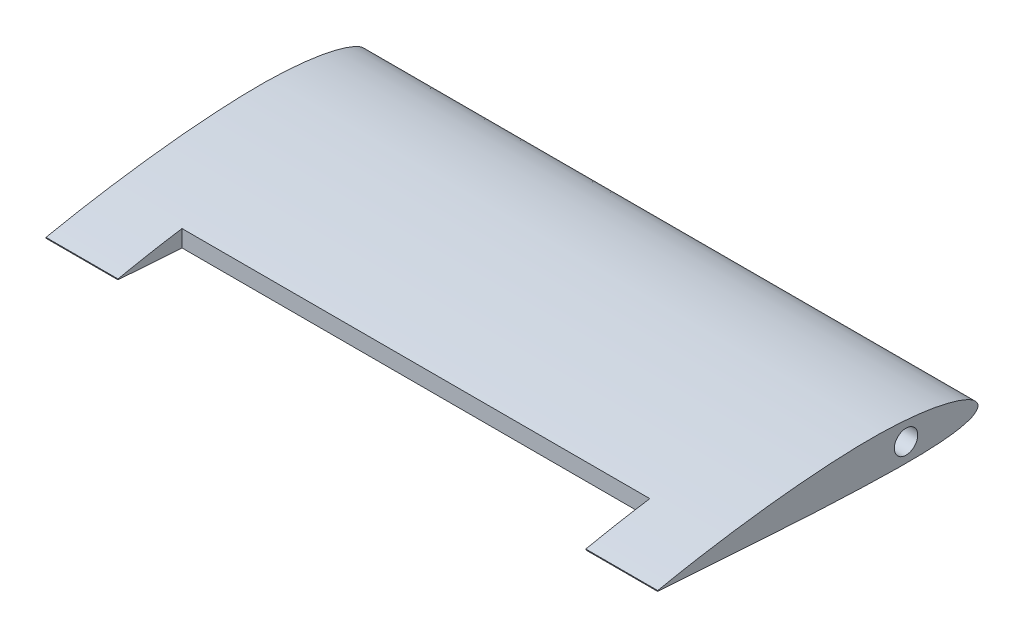
ISO-10303-21;
HEADER;
FILE_DESCRIPTION(('STEP AP214'),'2;1');
FILE_NAME('part.step','',(''),(''),'','','');
FILE_SCHEMA(('AUTOMOTIVE_DESIGN { 1 0 10303 214 1 1 1 1 }'));
ENDSEC;
DATA;
#1=APPLICATION_CONTEXT('core data for automotive mechanical design processes');
#2=APPLICATION_PROTOCOL_DEFINITION('international standard','automotive_design',2000,#1);
#3=PRODUCT_CONTEXT('',#1,'mechanical');
#4=PRODUCT('Part','Part','',(#3));
#5=PRODUCT_RELATED_PRODUCT_CATEGORY('part','',(#4));
#6=PRODUCT_DEFINITION_FORMATION('','',#4);
#7=PRODUCT_DEFINITION_CONTEXT('part definition',#1,'design');
#8=PRODUCT_DEFINITION('design','',#6,#7);
#9=PRODUCT_DEFINITION_SHAPE('','',#8);
#10=(LENGTH_UNIT() NAMED_UNIT(*) SI_UNIT(.MILLI.,.METRE.));
#11=(NAMED_UNIT(*) PLANE_ANGLE_UNIT() SI_UNIT($,.RADIAN.));
#12=(NAMED_UNIT(*) SI_UNIT($,.STERADIAN.) SOLID_ANGLE_UNIT());
#13=UNCERTAINTY_MEASURE_WITH_UNIT(LENGTH_MEASURE(1.E-05),#10,'distance_accuracy_value','');
#14=(GEOMETRIC_REPRESENTATION_CONTEXT(3) GLOBAL_UNCERTAINTY_ASSIGNED_CONTEXT((#13)) GLOBAL_UNIT_ASSIGNED_CONTEXT((#10,
#11,#12)) REPRESENTATION_CONTEXT('',''));
#15=CARTESIAN_POINT('',(0.,0.,0.));
#16=DIRECTION('',(0.,0.,1.));
#17=DIRECTION('',(1.,0.,0.));
#18=AXIS2_PLACEMENT_3D('',#15,#16,#17);
#19=CARTESIAN_POINT('',(0.,0.,89.));
#20=DIRECTION('',(0.,0.,1.));
#21=DIRECTION('',(1.,0.,0.));
#22=AXIS2_PLACEMENT_3D('',#19,#20,#21);
#23=PLANE('',#22);
#24=DIRECTION('',(0.,1.,0.));
#25=VECTOR('',#24,1.);
#26=CARTESIAN_POINT('',(-100.,0.,89.));
#27=LINE('',#26,#25);
#28=CARTESIAN_POINT('',(-100.,21.1572890238036,89.));
#29=VERTEX_POINT('',#28);
#30=CARTESIAN_POINT('',(-100.,21.3886732850242,89.));
#31=VERTEX_POINT('',#30);
#32=EDGE_CURVE('E151',#29,#31,#27,.T.);
#33=ORIENTED_EDGE('',*,*,#32,.F.);
#34=DIRECTION('',(1.,0.,0.));
#35=VECTOR('',#34,1.);
#36=CARTESIAN_POINT('',(-250.,21.1572890238036,89.));
#37=LINE('',#36,#35);
#38=CARTESIAN_POINT('',(-80.,21.1572890238036,89.));
#39=VERTEX_POINT('',#38);
#40=EDGE_CURVE('E156',#29,#39,#37,.T.);
#41=ORIENTED_EDGE('',*,*,#40,.T.);
#42=DIRECTION('',(0.,-1.,0.));
#43=VECTOR('',#42,1.);
#44=CARTESIAN_POINT('',(-80.,0.,89.));
#45=LINE('',#44,#43);
#46=CARTESIAN_POINT('',(-80.,21.3886732850242,89.));
#47=VERTEX_POINT('',#46);
#48=EDGE_CURVE('E200',#47,#39,#45,.T.);
#49=ORIENTED_EDGE('',*,*,#48,.F.);
#50=DIRECTION('',(1.,0.,0.));
#51=VECTOR('',#50,1.);
#52=CARTESIAN_POINT('',(-250.,21.3886732850242,89.));
#53=LINE('',#52,#51);
#54=EDGE_CURVE('E161',#31,#47,#53,.T.);
#55=ORIENTED_EDGE('',*,*,#54,.F.);
#56=EDGE_LOOP('',(#33,#41,#49,#55));
#57=FACE_BOUND('',#56,.T.);
#58=ADVANCED_FACE('F54',(#57),#23,.T.);
#59=CARTESIAN_POINT('',(-250.,21.3886732850242,89.));
#60=CARTESIAN_POINT('',(-250.,21.6924393138106,87.5175902156763));
#61=CARTESIAN_POINT('',(-250.,22.2991735538198,84.5566640796384));
#62=CARTESIAN_POINT('',(-250.,23.4104909631112,78.6297269469736));
#63=CARTESIAN_POINT('',(-250.,24.641831569462,71.2170631809324));
#64=CARTESIAN_POINT('',(-250.,25.9162390672229,62.3159799477099));
#65=CARTESIAN_POINT('',(-250.,26.9790478293723,53.4163650243348));
#66=CARTESIAN_POINT('',(-250.,27.757252312656,44.5128917718668));
#67=CARTESIAN_POINT('',(-250.,28.2842497525229,35.6114461447732));
#68=CARTESIAN_POINT('',(-250.,28.3734546736372,28.1847004811248));
#69=CARTESIAN_POINT('',(-250.,28.1277297242642,22.2491575224991));
#70=CARTESIAN_POINT('',(-250.,27.7676716658709,17.7938603249267));
#71=CARTESIAN_POINT('',(-250.,27.1974963055456,13.3329383648118));
#72=CARTESIAN_POINT('',(-250.,26.4953694537602,9.62034210956704));
#73=CARTESIAN_POINT('',(-250.,25.701015566182,6.66058751576171));
#74=CARTESIAN_POINT('',(-250.,24.9788303768218,4.4166755350325));
#75=CARTESIAN_POINT('',(-250.,24.1373761617376,2.51552543990555));
#76=CARTESIAN_POINT('',(-250.,23.1172060054036,0.875610555548998));
#77=CARTESIAN_POINT('',(-250.,21.3529663487488,-0.554450875401541));
#78=CARTESIAN_POINT('',(-250.,19.8022315361252,0.931001928104729));
#79=CARTESIAN_POINT('',(-250.,19.0949550918379,2.54024256096899));
#80=CARTESIAN_POINT('',(-250.,18.5577036137218,4.43302859202716));
#81=CARTESIAN_POINT('',(-250.,18.1724928525861,6.66955299200507));
#82=CARTESIAN_POINT('',(-250.,17.8437583770492,9.64115310370391));
#83=CARTESIAN_POINT('',(-250.,17.590735707999,13.3504314681179));
#84=CARTESIAN_POINT('',(-250.,17.4892914666729,17.8043187113869));
#85=CARTESIAN_POINT('',(-250.,17.5034280625483,22.2550272141336));
#86=CARTESIAN_POINT('',(-250.,17.6344002740936,28.1885067397123));
#87=CARTESIAN_POINT('',(-250.,17.8700772068071,35.6060485187279));
#88=CARTESIAN_POINT('',(-250.,18.280226492312,44.5059981210921));
#89=CARTESIAN_POINT('',(-250.,18.8133186654621,53.4033670106579));
#90=CARTESIAN_POINT('',(-250.,19.3674253006102,62.3022449763705));
#91=CARTESIAN_POINT('',(-250.,19.9283008784247,71.2026444966919));
#92=CARTESIAN_POINT('',(-250.,20.4448648269986,78.6172037371231));
#93=CARTESIAN_POINT('',(-250.,20.8433000555565,84.5506800402072));
#94=CARTESIAN_POINT('',(-250.,21.052621242818,87.5168254487195));
#95=CARTESIAN_POINT('',(-250.,21.1572890238036,89.));
#96=B_SPLINE_CURVE_WITH_KNOTS('',3,(#59,#60,#61,#62,#63,#64,#65,#66,#67,#68,#69,#70,#71,#72,#73,
#74,#75,#76,#77,#78,#79,#80,#81,#82,#83,#84,#85,#86,#87,#88,#89,#90,#91,#92,#93,#94,#95),
.UNSPECIFIED.,.F.,.F.,(4,1,1,1,1,1,1,1,1,1,1,1,1,1,1,1,1,1,1,1,1,1,1,1,1,1,1,1,1,1,1,1,1,1,4),
(0.,0.0250124897498648,0.0499592861642578,0.0996729249269686,0.149206319909966,
0.198581096615965,0.247805170456833,0.296916574601493,0.345952721793533,0.370491625569911,
0.395091203654929,0.41981479582396,0.444798575016595,0.457489818915221,0.47040640543549,
0.483879408669829,0.491264120322896,0.503458853294665,0.513609129403887,0.520450990700287,
0.533235387615153,0.545691039147803,0.558031884237173,0.582609167247894,0.607134741746914,
0.631652079836766,0.656174271859652,0.705233949250519,0.754320378530032,0.803437363555032,
0.852566095729537,0.901700994033255,0.950848809337271,0.975422716989279,1.),.UNSPECIFIED.);
#97=DIRECTION('',(1.,0.,0.));
#98=VECTOR('',#97,1.);
#99=SURFACE_OF_LINEAR_EXTRUSION('',#96,#98);
#100=DIRECTION('',(1.,0.,0.));
#101=VECTOR('',#100,1.);
#102=CARTESIAN_POINT('',(-250.,24.6104413253253,71.2));
#103=LINE('',#102,#101);
#104=CARTESIAN_POINT('',(-230.,24.6104413268867,71.2));
#105=VERTEX_POINT('',#104);
#106=CARTESIAN_POINT('',(-100.,24.6104413268867,71.2));
#107=VERTEX_POINT('',#106);
#108=EDGE_CURVE('E12',#105,#107,#103,.T.);
#109=ORIENTED_EDGE('',*,*,#108,.T.);
#110=CARTESIAN_POINT('',(-100.,21.3886732850242,89.));
#111=CARTESIAN_POINT('',(-100.,21.6924393138106,87.5175902156763));
#112=CARTESIAN_POINT('',(-100.,22.2991735538198,84.5566640796384));
#113=CARTESIAN_POINT('',(-100.,23.4104909631112,78.6297269469736));
#114=CARTESIAN_POINT('',(-100.,24.641831569462,71.2170631809324));
#115=CARTESIAN_POINT('',(-100.,25.9162390672229,62.3159799477099));
#116=CARTESIAN_POINT('',(-100.,26.9790478293723,53.4163650243348));
#117=CARTESIAN_POINT('',(-100.,27.757252312656,44.5128917718668));
#118=CARTESIAN_POINT('',(-100.,28.2842497525229,35.6114461447732));
#119=CARTESIAN_POINT('',(-100.,28.3734546736372,28.1847004811248));
#120=CARTESIAN_POINT('',(-100.,28.1277297242642,22.2491575224991));
#121=CARTESIAN_POINT('',(-100.,27.7676716658709,17.7938603249267));
#122=CARTESIAN_POINT('',(-100.,27.1974963055456,13.3329383648118));
#123=CARTESIAN_POINT('',(-100.,26.4953694537602,9.62034210956704));
#124=CARTESIAN_POINT('',(-100.,25.701015566182,6.66058751576171));
#125=CARTESIAN_POINT('',(-100.,24.9788303768218,4.4166755350325));
#126=CARTESIAN_POINT('',(-100.,24.1373761617376,2.51552543990555));
#127=CARTESIAN_POINT('',(-100.,23.1172060054036,0.875610555548998));
#128=CARTESIAN_POINT('',(-100.,21.3529663487488,-0.554450875401541));
#129=CARTESIAN_POINT('',(-100.,19.8022315361252,0.931001928104729));
#130=CARTESIAN_POINT('',(-100.,19.0949550918379,2.54024256096899));
#131=CARTESIAN_POINT('',(-100.,18.5577036137218,4.43302859202716));
#132=CARTESIAN_POINT('',(-100.,18.1724928525861,6.66955299200507));
#133=CARTESIAN_POINT('',(-100.,17.8437583770492,9.64115310370391));
#134=CARTESIAN_POINT('',(-100.,17.590735707999,13.3504314681179));
#135=CARTESIAN_POINT('',(-100.,17.4892914666729,17.8043187113869));
#136=CARTESIAN_POINT('',(-100.,17.5034280625483,22.2550272141336));
#137=CARTESIAN_POINT('',(-100.,17.6344002740936,28.1885067397123));
#138=CARTESIAN_POINT('',(-100.,17.8700772068071,35.6060485187279));
#139=CARTESIAN_POINT('',(-100.,18.280226492312,44.5059981210921));
#140=CARTESIAN_POINT('',(-100.,18.8133186654621,53.4033670106579));
#141=CARTESIAN_POINT('',(-100.,19.3674253006102,62.3022449763705));
#142=CARTESIAN_POINT('',(-100.,19.9283008784247,71.2026444966919));
#143=CARTESIAN_POINT('',(-100.,20.4448648269986,78.6172037371231));
#144=CARTESIAN_POINT('',(-100.,20.8433000555565,84.5506800402072));
#145=CARTESIAN_POINT('',(-100.,21.052621242818,87.5168254487195));
#146=CARTESIAN_POINT('',(-100.,21.1572890238036,89.));
#147=B_SPLINE_CURVE_WITH_KNOTS('',3,(#110,#111,#112,#113,#114,#115,#116,#117,#118,#119,#120,
#121,#122,#123,#124,#125,#126,#127,#128,#129,#130,#131,#132,#133,#134,#135,#136,#137,#138,#139,
#140,#141,#142,#143,#144,#145,#146),.UNSPECIFIED.,.F.,.F.,(4,1,1,1,1,1,1,1,1,1,1,1,1,1,1,1,1,1,
1,1,1,1,1,1,1,1,1,1,1,1,1,1,1,1,4),(0.,0.0250124897498648,0.0499592861642578,0.0996729249269686,
0.149206319909966,0.198581096615965,0.247805170456833,0.296916574601493,0.345952721793533,
0.370491625569911,0.395091203654929,0.41981479582396,0.444798575016595,0.457489818915221,
0.47040640543549,0.483879408669829,0.491264120322896,0.503458853294665,0.513609129403887,
0.520450990700287,0.533235387615153,0.545691039147803,0.558031884237173,0.582609167247894,
0.607134741746914,0.631652079836766,0.656174271859652,0.705233949250519,0.754320378530032,
0.803437363555032,0.852566095729537,0.901700994033255,0.950848809337271,0.975422716989279,1.),.UNSPECIFIED.);
#148=EDGE_CURVE('E216',#107,#31,#147,.F.);
#149=ORIENTED_EDGE('',*,*,#148,.T.);
#150=ORIENTED_EDGE('',*,*,#54,.T.);
#151=CARTESIAN_POINT('',(-80.,21.1572890238036,89.));
#152=CARTESIAN_POINT('',(-80.,21.052621242818,87.5168254487195));
#153=CARTESIAN_POINT('',(-80.,20.8433000555565,84.5506800402072));
#154=CARTESIAN_POINT('',(-80.,20.4448648269986,78.6172037371231));
#155=CARTESIAN_POINT('',(-80.,19.9283008784247,71.2026444966919));
#156=CARTESIAN_POINT('',(-80.,19.3674253006102,62.3022449763705));
#157=CARTESIAN_POINT('',(-80.,18.8133186654621,53.4033670106579));
#158=CARTESIAN_POINT('',(-80.,18.280226492312,44.5059981210921));
#159=CARTESIAN_POINT('',(-80.,17.8700772068071,35.6060485187279));
#160=CARTESIAN_POINT('',(-80.,17.6344002740936,28.1885067397123));
#161=CARTESIAN_POINT('',(-80.,17.5034280625483,22.2550272141336));
#162=CARTESIAN_POINT('',(-80.,17.4892914666729,17.8043187113869));
#163=CARTESIAN_POINT('',(-80.,17.590735707999,13.3504314681179));
#164=CARTESIAN_POINT('',(-80.,17.8437583770492,9.64115310370391));
#165=CARTESIAN_POINT('',(-80.,18.1724928525861,6.66955299200507));
#166=CARTESIAN_POINT('',(-80.,18.5577036137218,4.43302859202716));
#167=CARTESIAN_POINT('',(-80.,19.0949550918379,2.54024256096899));
#168=CARTESIAN_POINT('',(-80.,19.8022315361252,0.931001928104729));
#169=CARTESIAN_POINT('',(-80.,21.3529663487488,-0.554450875401541));
#170=CARTESIAN_POINT('',(-80.,23.1172060054036,0.875610555548998));
#171=CARTESIAN_POINT('',(-80.,24.1373761617376,2.51552543990555));
#172=CARTESIAN_POINT('',(-80.,24.9788303768218,4.4166755350325));
#173=CARTESIAN_POINT('',(-80.,25.701015566182,6.66058751576171));
#174=CARTESIAN_POINT('',(-80.,26.4953694537602,9.62034210956704));
#175=CARTESIAN_POINT('',(-80.,27.1974963055456,13.3329383648118));
#176=CARTESIAN_POINT('',(-80.,27.7676716658709,17.7938603249267));
#177=CARTESIAN_POINT('',(-80.,28.1277297242642,22.2491575224991));
#178=CARTESIAN_POINT('',(-80.,28.3734546736372,28.1847004811248));
#179=CARTESIAN_POINT('',(-80.,28.2842497525229,35.6114461447732));
#180=CARTESIAN_POINT('',(-80.,27.757252312656,44.5128917718668));
#181=CARTESIAN_POINT('',(-80.,26.9790478293723,53.4163650243348));
#182=CARTESIAN_POINT('',(-80.,25.9162390672229,62.3159799477099));
#183=CARTESIAN_POINT('',(-80.,24.641831569462,71.2170631809324));
#184=CARTESIAN_POINT('',(-80.,23.4104909631112,78.6297269469736));
#185=CARTESIAN_POINT('',(-80.,22.2991735538198,84.5566640796384));
#186=CARTESIAN_POINT('',(-80.,21.6924393138106,87.5175902156763));
#187=CARTESIAN_POINT('',(-80.,21.3886732850242,89.));
#188=B_SPLINE_CURVE_WITH_KNOTS('',3,(#151,#152,#153,#154,#155,#156,#157,#158,#159,#160,#161,
#162,#163,#164,#165,#166,#167,#168,#169,#170,#171,#172,#173,#174,#175,#176,#177,#178,#179,#180,
#181,#182,#183,#184,#185,#186,#187),.UNSPECIFIED.,.F.,.F.,(4,1,1,1,1,1,1,1,1,1,1,1,1,1,1,1,1,1,
1,1,1,1,1,1,1,1,1,1,1,1,1,1,1,1,4),(0.,0.0245772830107215,0.0491511906627294,0.0982990059667455,
0.147433904270463,0.196562636444968,0.245679621469968,0.294766050749481,0.343825728140348,
0.368347920163234,0.392865258253086,0.417390832752106,0.441968115762827,0.454308960852197,
0.466764612384847,0.479549009299713,0.486390870596113,0.496541146705335,0.508735879677104,
0.516120591330171,0.52959359456451,0.542510181084779,0.555201424983405,0.58018520417604,
0.604908796345071,0.629508374430089,0.654047278206467,0.703083425398507,0.752194829543167,
0.801418903384035,0.850793680090034,0.900327075073031,0.950040713835742,0.974987510250135,1.),.UNSPECIFIED.);
#189=EDGE_CURVE('E176',#39,#47,#188,.T.);
#190=ORIENTED_EDGE('',*,*,#189,.F.);
#191=ORIENTED_EDGE('',*,*,#40,.F.);
#192=CARTESIAN_POINT('',(-100.,19.9379916386358,71.2));
#193=VERTEX_POINT('',#192);
#194=EDGE_CURVE('E150',#29,#193,#147,.F.);
#195=ORIENTED_EDGE('',*,*,#194,.T.);
#196=DIRECTION('',(1.,0.,0.));
#197=VECTOR('',#196,1.);
#198=CARTESIAN_POINT('',(-250.,19.9379916373415,71.2));
#199=LINE('',#198,#197);
#200=CARTESIAN_POINT('',(-230.,19.9379916386358,71.2));
#201=VERTEX_POINT('',#200);
#202=EDGE_CURVE('E62',#193,#201,#199,.F.);
#203=ORIENTED_EDGE('',*,*,#202,.T.);
#204=CARTESIAN_POINT('',(-230.,21.3886732850242,89.));
#205=CARTESIAN_POINT('',(-230.,21.6924393138106,87.5175902156763));
#206=CARTESIAN_POINT('',(-230.,22.2991735538198,84.5566640796384));
#207=CARTESIAN_POINT('',(-230.,23.4104909631112,78.6297269469736));
#208=CARTESIAN_POINT('',(-230.,24.641831569462,71.2170631809324));
#209=CARTESIAN_POINT('',(-230.,25.9162390672229,62.3159799477099));
#210=CARTESIAN_POINT('',(-230.,26.9790478293723,53.4163650243348));
#211=CARTESIAN_POINT('',(-230.,27.757252312656,44.5128917718668));
#212=CARTESIAN_POINT('',(-230.,28.2842497525229,35.6114461447732));
#213=CARTESIAN_POINT('',(-230.,28.3734546736372,28.1847004811248));
#214=CARTESIAN_POINT('',(-230.,28.1277297242642,22.2491575224991));
#215=CARTESIAN_POINT('',(-230.,27.7676716658709,17.7938603249267));
#216=CARTESIAN_POINT('',(-230.,27.1974963055456,13.3329383648118));
#217=CARTESIAN_POINT('',(-230.,26.4953694537602,9.62034210956704));
#218=CARTESIAN_POINT('',(-230.,25.701015566182,6.66058751576171));
#219=CARTESIAN_POINT('',(-230.,24.9788303768218,4.4166755350325));
#220=CARTESIAN_POINT('',(-230.,24.1373761617376,2.51552543990555));
#221=CARTESIAN_POINT('',(-230.,23.1172060054036,0.875610555548998));
#222=CARTESIAN_POINT('',(-230.,21.3529663487488,-0.554450875401541));
#223=CARTESIAN_POINT('',(-230.,19.8022315361252,0.931001928104729));
#224=CARTESIAN_POINT('',(-230.,19.0949550918379,2.54024256096899));
#225=CARTESIAN_POINT('',(-230.,18.5577036137218,4.43302859202716));
#226=CARTESIAN_POINT('',(-230.,18.1724928525861,6.66955299200507));
#227=CARTESIAN_POINT('',(-230.,17.8437583770492,9.64115310370391));
#228=CARTESIAN_POINT('',(-230.,17.590735707999,13.3504314681179));
#229=CARTESIAN_POINT('',(-230.,17.4892914666729,17.8043187113869));
#230=CARTESIAN_POINT('',(-230.,17.5034280625483,22.2550272141336));
#231=CARTESIAN_POINT('',(-230.,17.6344002740936,28.1885067397123));
#232=CARTESIAN_POINT('',(-230.,17.8700772068071,35.6060485187279));
#233=CARTESIAN_POINT('',(-230.,18.280226492312,44.5059981210921));
#234=CARTESIAN_POINT('',(-230.,18.8133186654621,53.4033670106579));
#235=CARTESIAN_POINT('',(-230.,19.3674253006102,62.3022449763705));
#236=CARTESIAN_POINT('',(-230.,19.9283008784247,71.2026444966919));
#237=CARTESIAN_POINT('',(-230.,20.4448648269986,78.6172037371231));
#238=CARTESIAN_POINT('',(-230.,20.8433000555565,84.5506800402072));
#239=CARTESIAN_POINT('',(-230.,21.052621242818,87.5168254487195));
#240=CARTESIAN_POINT('',(-230.,21.1572890238036,89.));
#241=B_SPLINE_CURVE_WITH_KNOTS('',3,(#204,#205,#206,#207,#208,#209,#210,#211,#212,#213,#214,
#215,#216,#217,#218,#219,#220,#221,#222,#223,#224,#225,#226,#227,#228,#229,#230,#231,#232,#233,
#234,#235,#236,#237,#238,#239,#240),.UNSPECIFIED.,.F.,.F.,(4,1,1,1,1,1,1,1,1,1,1,1,1,1,1,1,1,1,
1,1,1,1,1,1,1,1,1,1,1,1,1,1,1,1,4),(0.,0.0250124897498648,0.0499592861642578,0.0996729249269686,
0.149206319909966,0.198581096615965,0.247805170456833,0.296916574601493,0.345952721793533,
0.370491625569911,0.395091203654929,0.41981479582396,0.444798575016595,0.457489818915221,
0.47040640543549,0.483879408669829,0.491264120322896,0.503458853294665,0.513609129403887,
0.520450990700287,0.533235387615153,0.545691039147803,0.558031884237173,0.582609167247894,
0.607134741746914,0.631652079836766,0.656174271859652,0.705233949250519,0.754320378530032,
0.803437363555032,0.852566095729537,0.901700994033255,0.950848809337271,0.975422716989279,1.),.UNSPECIFIED.);
#242=CARTESIAN_POINT('',(-230.,21.1572890238036,89.));
#243=VERTEX_POINT('',#242);
#244=EDGE_CURVE('E130',#201,#243,#241,.T.);
#245=ORIENTED_EDGE('',*,*,#244,.T.);
#246=CARTESIAN_POINT('',(-250.,21.1572890238036,89.));
#247=VERTEX_POINT('',#246);
#248=EDGE_CURVE('E159',#247,#243,#37,.T.);
#249=ORIENTED_EDGE('',*,*,#248,.F.);
#250=CARTESIAN_POINT('',(-250.,21.3886732850242,89.));
#251=VERTEX_POINT('',#250);
#252=EDGE_CURVE('E192',#251,#247,#96,.T.);
#253=ORIENTED_EDGE('',*,*,#252,.F.);
#254=CARTESIAN_POINT('',(-230.,21.3886732850242,89.));
#255=VERTEX_POINT('',#254);
#256=EDGE_CURVE('E160',#251,#255,#53,.T.);
#257=ORIENTED_EDGE('',*,*,#256,.T.);
#258=EDGE_CURVE('E69',#255,#105,#241,.T.);
#259=ORIENTED_EDGE('',*,*,#258,.T.);
#260=EDGE_LOOP('',(#109,#149,#150,#190,#191,#195,#203,#245,#249,#253,#257,#259));
#261=FACE_BOUND('',#260,.T.);
#262=DIRECTION('',(1.,0.,0.));
#263=VECTOR('',#262,1.);
#264=CARTESIAN_POINT('',(-250.,19.3809270136828,62.4999990139523));
#265=LINE('',#264,#263);
#266=CARTESIAN_POINT('',(-146.5,19.3809270136828,62.4999990139523));
#267=VERTEX_POINT('',#266);
#268=CARTESIAN_POINT('',(-183.5,19.3809270136828,62.499999013952));
#269=VERTEX_POINT('',#268);
#270=EDGE_CURVE('E155',#267,#269,#265,.F.);
#271=ORIENTED_EDGE('',*,*,#270,.F.);
#272=CARTESIAN_POINT('',(-146.5,21.3886732850242,89.));
#273=CARTESIAN_POINT('',(-146.5,21.6924393138106,87.5175902156763));
#274=CARTESIAN_POINT('',(-146.5,22.2991735538198,84.5566640796384));
#275=CARTESIAN_POINT('',(-146.5,23.4104909631112,78.6297269469736));
#276=CARTESIAN_POINT('',(-146.5,24.641831569462,71.2170631809324));
#277=CARTESIAN_POINT('',(-146.5,25.9162390672229,62.3159799477099));
#278=CARTESIAN_POINT('',(-146.5,26.9790478293723,53.4163650243348));
#279=CARTESIAN_POINT('',(-146.5,27.757252312656,44.5128917718668));
#280=CARTESIAN_POINT('',(-146.5,28.2842497525229,35.6114461447732));
#281=CARTESIAN_POINT('',(-146.5,28.3734546736372,28.1847004811248));
#282=CARTESIAN_POINT('',(-146.5,28.1277297242642,22.2491575224991));
#283=CARTESIAN_POINT('',(-146.5,27.7676716658709,17.7938603249267));
#284=CARTESIAN_POINT('',(-146.5,27.1974963055456,13.3329383648118));
#285=CARTESIAN_POINT('',(-146.5,26.4953694537602,9.62034210956704));
#286=CARTESIAN_POINT('',(-146.5,25.701015566182,6.66058751576171));
#287=CARTESIAN_POINT('',(-146.5,24.9788303768218,4.4166755350325));
#288=CARTESIAN_POINT('',(-146.5,24.1373761617376,2.51552543990555));
#289=CARTESIAN_POINT('',(-146.5,23.1172060054036,0.875610555548998));
#290=CARTESIAN_POINT('',(-146.5,21.3529663487488,-0.554450875401541));
#291=CARTESIAN_POINT('',(-146.5,19.8022315361252,0.931001928104729));
#292=CARTESIAN_POINT('',(-146.5,19.0949550918379,2.54024256096899));
#293=CARTESIAN_POINT('',(-146.5,18.5577036137218,4.43302859202716));
#294=CARTESIAN_POINT('',(-146.5,18.1724928525861,6.66955299200507));
#295=CARTESIAN_POINT('',(-146.5,17.8437583770492,9.64115310370391));
#296=CARTESIAN_POINT('',(-146.5,17.590735707999,13.3504314681179));
#297=CARTESIAN_POINT('',(-146.5,17.4892914666729,17.8043187113869));
#298=CARTESIAN_POINT('',(-146.5,17.5034280625483,22.2550272141336));
#299=CARTESIAN_POINT('',(-146.5,17.6344002740936,28.1885067397123));
#300=CARTESIAN_POINT('',(-146.5,17.8700772068071,35.6060485187279));
#301=CARTESIAN_POINT('',(-146.5,18.280226492312,44.5059981210921));
#302=CARTESIAN_POINT('',(-146.5,18.8133186654621,53.4033670106579));
#303=CARTESIAN_POINT('',(-146.5,19.3674253006102,62.3022449763705));
#304=CARTESIAN_POINT('',(-146.5,19.9283008784247,71.2026444966919));
#305=CARTESIAN_POINT('',(-146.5,20.4448648269986,78.6172037371231));
#306=CARTESIAN_POINT('',(-146.5,20.8433000555565,84.5506800402072));
#307=CARTESIAN_POINT('',(-146.5,21.052621242818,87.5168254487195));
#308=CARTESIAN_POINT('',(-146.5,21.1572890238036,89.));
#309=B_SPLINE_CURVE_WITH_KNOTS('',3,(#272,#273,#274,#275,#276,#277,#278,#279,#280,#281,#282,
#283,#284,#285,#286,#287,#288,#289,#290,#291,#292,#293,#294,#295,#296,#297,#298,#299,#300,#301,
#302,#303,#304,#305,#306,#307,#308),.UNSPECIFIED.,.F.,.F.,(4,1,1,1,1,1,1,1,1,1,1,1,1,1,1,1,1,1,
1,1,1,1,1,1,1,1,1,1,1,1,1,1,1,1,4),(0.,0.0250124897498648,0.0499592861642578,0.0996729249269686,
0.149206319909966,0.198581096615965,0.247805170456833,0.296916574601493,0.345952721793533,
0.370491625569911,0.395091203654929,0.41981479582396,0.444798575016595,0.457489818915221,
0.47040640543549,0.483879408669829,0.491264120322896,0.503458853294665,0.513609129403887,
0.520450990700287,0.533235387615153,0.545691039147803,0.558031884237173,0.582609167247894,
0.607134741746914,0.631652079836766,0.656174271859652,0.705233949250519,0.754320378530032,
0.803437363555032,0.852566095729537,0.901700994033255,0.950848809337271,0.975422716989279,1.),.UNSPECIFIED.);
#310=CARTESIAN_POINT('',(-146.5,17.6012934281473,26.4999990139523));
#311=VERTEX_POINT('',#310);
#312=EDGE_CURVE('E329',#311,#267,#309,.T.);
#313=ORIENTED_EDGE('',*,*,#312,.F.);
#314=DIRECTION('',(1.,0.,0.));
#315=VECTOR('',#314,1.);
#316=CARTESIAN_POINT('',(-250.,17.6012934281473,26.4999990139523));
#317=LINE('',#316,#315);
#318=CARTESIAN_POINT('',(-183.5,17.6012934276601,26.4999990139523));
#319=VERTEX_POINT('',#318);
#320=EDGE_CURVE('E324',#319,#311,#317,.T.);
#321=ORIENTED_EDGE('',*,*,#320,.F.);
#322=CARTESIAN_POINT('',(-183.5,21.3886732850242,89.));
#323=CARTESIAN_POINT('',(-183.5,21.6924393138106,87.5175902156763));
#324=CARTESIAN_POINT('',(-183.5,22.2991735538198,84.5566640796384));
#325=CARTESIAN_POINT('',(-183.5,23.4104909631112,78.6297269469736));
#326=CARTESIAN_POINT('',(-183.5,24.641831569462,71.2170631809324));
#327=CARTESIAN_POINT('',(-183.5,25.9162390672229,62.3159799477099));
#328=CARTESIAN_POINT('',(-183.5,26.9790478293723,53.4163650243348));
#329=CARTESIAN_POINT('',(-183.5,27.757252312656,44.5128917718668));
#330=CARTESIAN_POINT('',(-183.5,28.2842497525229,35.6114461447732));
#331=CARTESIAN_POINT('',(-183.5,28.3734546736372,28.1847004811248));
#332=CARTESIAN_POINT('',(-183.5,28.1277297242642,22.2491575224991));
#333=CARTESIAN_POINT('',(-183.5,27.7676716658709,17.7938603249267));
#334=CARTESIAN_POINT('',(-183.5,27.1974963055456,13.3329383648118));
#335=CARTESIAN_POINT('',(-183.5,26.4953694537602,9.62034210956704));
#336=CARTESIAN_POINT('',(-183.5,25.701015566182,6.66058751576171));
#337=CARTESIAN_POINT('',(-183.5,24.9788303768218,4.4166755350325));
#338=CARTESIAN_POINT('',(-183.5,24.1373761617376,2.51552543990555));
#339=CARTESIAN_POINT('',(-183.5,23.1172060054036,0.875610555548998));
#340=CARTESIAN_POINT('',(-183.5,21.3529663487488,-0.554450875401541));
#341=CARTESIAN_POINT('',(-183.5,19.8022315361252,0.931001928104729));
#342=CARTESIAN_POINT('',(-183.5,19.0949550918379,2.54024256096899));
#343=CARTESIAN_POINT('',(-183.5,18.5577036137218,4.43302859202716));
#344=CARTESIAN_POINT('',(-183.5,18.1724928525861,6.66955299200507));
#345=CARTESIAN_POINT('',(-183.5,17.8437583770492,9.64115310370391));
#346=CARTESIAN_POINT('',(-183.5,17.590735707999,13.3504314681179));
#347=CARTESIAN_POINT('',(-183.5,17.4892914666729,17.8043187113869));
#348=CARTESIAN_POINT('',(-183.5,17.5034280625483,22.2550272141336));
#349=CARTESIAN_POINT('',(-183.5,17.6344002740936,28.1885067397123));
#350=CARTESIAN_POINT('',(-183.5,17.8700772068071,35.6060485187279));
#351=CARTESIAN_POINT('',(-183.5,18.280226492312,44.5059981210921));
#352=CARTESIAN_POINT('',(-183.5,18.8133186654621,53.4033670106579));
#353=CARTESIAN_POINT('',(-183.5,19.3674253006102,62.3022449763705));
#354=CARTESIAN_POINT('',(-183.5,19.9283008784247,71.2026444966919));
#355=CARTESIAN_POINT('',(-183.5,20.4448648269986,78.6172037371231));
#356=CARTESIAN_POINT('',(-183.5,20.8433000555565,84.5506800402072));
#357=CARTESIAN_POINT('',(-183.5,21.052621242818,87.5168254487195));
#358=CARTESIAN_POINT('',(-183.5,21.1572890238036,89.));
#359=B_SPLINE_CURVE_WITH_KNOTS('',3,(#322,#323,#324,#325,#326,#327,#328,#329,#330,#331,#332,
#333,#334,#335,#336,#337,#338,#339,#340,#341,#342,#343,#344,#345,#346,#347,#348,#349,#350,#351,
#352,#353,#354,#355,#356,#357,#358),.UNSPECIFIED.,.F.,.F.,(4,1,1,1,1,1,1,1,1,1,1,1,1,1,1,1,1,1,
1,1,1,1,1,1,1,1,1,1,1,1,1,1,1,1,4),(0.,0.0250124897498648,0.0499592861642578,0.0996729249269686,
0.149206319909966,0.198581096615965,0.247805170456833,0.296916574601493,0.345952721793533,
0.370491625569911,0.395091203654929,0.41981479582396,0.444798575016595,0.457489818915221,
0.47040640543549,0.483879408669829,0.491264120322896,0.503458853294665,0.513609129403887,
0.520450990700287,0.533235387615153,0.545691039147803,0.558031884237173,0.582609167247894,
0.607134741746914,0.631652079836766,0.656174271859652,0.705233949250519,0.754320378530032,
0.803437363555032,0.852566095729537,0.901700994033255,0.950848809337271,0.975422716989279,1.),.UNSPECIFIED.);
#360=EDGE_CURVE('E224',#269,#319,#359,.F.);
#361=ORIENTED_EDGE('',*,*,#360,.F.);
#362=EDGE_LOOP('',(#271,#313,#321,#361));
#363=FACE_BOUND('',#362,.T.);
#364=ADVANCED_FACE('F147',(#261,#363),#99,.F.);
#365=DIRECTION('',(0.,-1.,0.));
#366=VECTOR('',#365,1.);
#367=CARTESIAN_POINT('',(-230.,0.,89.));
#368=LINE('',#367,#366);
#369=EDGE_CURVE('E134',#255,#243,#368,.T.);
#370=ORIENTED_EDGE('',*,*,#369,.F.);
#371=ORIENTED_EDGE('',*,*,#256,.F.);
#372=DIRECTION('',(0.,1.,0.));
#373=VECTOR('',#372,1.);
#374=CARTESIAN_POINT('',(-250.,21.3886732850242,89.));
#375=LINE('',#374,#373);
#376=EDGE_CURVE('E199',#247,#251,#375,.T.);
#377=ORIENTED_EDGE('',*,*,#376,.F.);
#378=ORIENTED_EDGE('',*,*,#248,.T.);
#379=EDGE_LOOP('',(#370,#371,#377,#378));
#380=FACE_BOUND('',#379,.T.);
#381=ADVANCED_FACE('F56',(#380),#23,.T.);
#382=CARTESIAN_POINT('',(-250.,21.857676686436,0.088810388911666));
#383=DIRECTION('',(1.,0.,0.));
#384=DIRECTION('',(0.,0.,-1.));
#385=AXIS2_PLACEMENT_3D('',#382,#383,#384);
#386=PLANE('',#385);
#387=CARTESIAN_POINT('',(-250.,22.7191945863651,20.));
#388=DIRECTION('',(1.,0.,0.));
#389=DIRECTION('',(0.,0.,-1.));
#390=AXIS2_PLACEMENT_3D('',#387,#388,#389);
#391=CIRCLE('',#390,3.25);
#392=CARTESIAN_POINT('',(-250.,22.7191945863651,23.25));
#393=VERTEX_POINT('',#392);
#394=EDGE_CURVE('E227',#393,#393,#391,.T.);
#395=ORIENTED_EDGE('',*,*,#394,.T.);
#396=EDGE_LOOP('',(#395));
#397=FACE_BOUND('',#396,.T.);
#398=ORIENTED_EDGE('',*,*,#252,.T.);
#399=ORIENTED_EDGE('',*,*,#376,.T.);
#400=EDGE_LOOP('',(#398,#399));
#401=FACE_BOUND('',#400,.T.);
#402=ADVANCED_FACE('F190',(#397,#401),#386,.F.);
#403=CARTESIAN_POINT('',(-80.,0.,0.));
#404=DIRECTION('',(-1.,0.,0.));
#405=DIRECTION('',(0.,0.,1.));
#406=AXIS2_PLACEMENT_3D('',#403,#404,#405);
#407=PLANE('',#406);
#408=CARTESIAN_POINT('',(-80.,22.7191945863651,20.));
#409=DIRECTION('',(-1.,0.,0.));
#410=DIRECTION('',(0.,0.,1.));
#411=AXIS2_PLACEMENT_3D('',#408,#409,#410);
#412=CIRCLE('',#411,3.25);
#413=CARTESIAN_POINT('',(-80.,22.7191945863651,23.25));
#414=VERTEX_POINT('',#413);
#415=EDGE_CURVE('E229',#414,#414,#412,.T.);
#416=ORIENTED_EDGE('',*,*,#415,.T.);
#417=EDGE_LOOP('',(#416));
#418=FACE_BOUND('',#417,.T.);
#419=ORIENTED_EDGE('',*,*,#48,.T.);
#420=ORIENTED_EDGE('',*,*,#189,.T.);
#421=EDGE_LOOP('',(#419,#420));
#422=FACE_BOUND('',#421,.T.);
#423=ADVANCED_FACE('F223',(#418,#422),#407,.F.);
#424=CARTESIAN_POINT('',(-79.9749659546181,22.7191945863651,20.));
#425=DIRECTION('',(-1.,0.,0.));
#426=DIRECTION('',(0.,0.,1.));
#427=AXIS2_PLACEMENT_3D('',#424,#425,#426);
#428=CYLINDRICAL_SURFACE('',#427,3.25);
#429=CARTESIAN_POINT('',(-80.,22.7191945863651,23.25));
#430=CARTESIAN_POINT('',(-81.7708333333333,22.7191945863651,23.25));
#431=CARTESIAN_POINT('',(-83.5416666666667,22.7191945863651,23.25));
#432=CARTESIAN_POINT('',(-87.0833333333333,22.7191945863651,23.25));
#433=CARTESIAN_POINT('',(-88.8541666666667,22.7191945863651,23.25));
#434=CARTESIAN_POINT('',(-92.3958333333333,22.7191945863651,23.25));
#435=CARTESIAN_POINT('',(-94.1666666666667,22.7191945863651,23.25));
#436=CARTESIAN_POINT('',(-97.7083333333333,22.7191945863651,23.25));
#437=CARTESIAN_POINT('',(-99.4791666666667,22.7191945863651,23.25));
#438=CARTESIAN_POINT('',(-103.020833333333,22.7191945863651,23.25));
#439=CARTESIAN_POINT('',(-104.791666666667,22.7191945863651,23.25));
#440=CARTESIAN_POINT('',(-108.333333333333,22.7191945863651,23.25));
#441=CARTESIAN_POINT('',(-110.104166666667,22.7191945863651,23.25));
#442=CARTESIAN_POINT('',(-113.645833333333,22.7191945863651,23.25));
#443=CARTESIAN_POINT('',(-115.416666666667,22.7191945863651,23.25));
#444=CARTESIAN_POINT('',(-118.958333333333,22.7191945863651,23.25));
#445=CARTESIAN_POINT('',(-120.729166666667,22.7191945863651,23.25));
#446=CARTESIAN_POINT('',(-124.270833333333,22.7191945863651,23.25));
#447=CARTESIAN_POINT('',(-126.041666666667,22.7191945863651,23.25));
#448=CARTESIAN_POINT('',(-129.583333333333,22.7191945863651,23.25));
#449=CARTESIAN_POINT('',(-131.354166666667,22.7191945863651,23.25));
#450=CARTESIAN_POINT('',(-134.895833333333,22.7191945863651,23.25));
#451=CARTESIAN_POINT('',(-136.666666666667,22.7191945863651,23.25));
#452=CARTESIAN_POINT('',(-140.208333333333,22.7191945863651,23.25));
#453=CARTESIAN_POINT('',(-141.979166666667,22.7191945863651,23.25));
#454=CARTESIAN_POINT('',(-145.520833333333,22.7191945863651,23.25));
#455=CARTESIAN_POINT('',(-147.291666666667,22.7191945863651,23.25));
#456=CARTESIAN_POINT('',(-150.833333333333,22.7191945863651,23.25));
#457=CARTESIAN_POINT('',(-152.604166666667,22.7191945863651,23.25));
#458=CARTESIAN_POINT('',(-156.145833333333,22.7191945863651,23.25));
#459=CARTESIAN_POINT('',(-157.916666666667,22.7191945863651,23.25));
#460=CARTESIAN_POINT('',(-161.458333333333,22.7191945863651,23.25));
#461=CARTESIAN_POINT('',(-163.229166666667,22.7191945863651,23.25));
#462=CARTESIAN_POINT('',(-166.770833333333,22.7191945863651,23.25));
#463=CARTESIAN_POINT('',(-168.541666666667,22.7191945863651,23.25));
#464=CARTESIAN_POINT('',(-172.083333333333,22.7191945863651,23.25));
#465=CARTESIAN_POINT('',(-173.854166666667,22.7191945863651,23.25));
#466=CARTESIAN_POINT('',(-177.395833333333,22.7191945863651,23.25));
#467=CARTESIAN_POINT('',(-179.166666666667,22.7191945863651,23.25));
#468=CARTESIAN_POINT('',(-182.708333333333,22.7191945863651,23.25));
#469=CARTESIAN_POINT('',(-184.479166666667,22.7191945863651,23.25));
#470=CARTESIAN_POINT('',(-188.020833333333,22.7191945863651,23.25));
#471=CARTESIAN_POINT('',(-189.791666666667,22.7191945863651,23.25));
#472=CARTESIAN_POINT('',(-193.333333333333,22.7191945863651,23.25));
#473=CARTESIAN_POINT('',(-195.104166666667,22.7191945863651,23.25));
#474=CARTESIAN_POINT('',(-198.645833333333,22.7191945863651,23.25));
#475=CARTESIAN_POINT('',(-200.416666666667,22.7191945863651,23.25));
#476=CARTESIAN_POINT('',(-203.958333333333,22.7191945863651,23.25));
#477=CARTESIAN_POINT('',(-205.729166666667,22.7191945863651,23.25));
#478=CARTESIAN_POINT('',(-209.270833333333,22.7191945863651,23.25));
#479=CARTESIAN_POINT('',(-211.041666666667,22.7191945863651,23.25));
#480=CARTESIAN_POINT('',(-214.583333333333,22.7191945863651,23.25));
#481=CARTESIAN_POINT('',(-216.354166666667,22.7191945863651,23.25));
#482=CARTESIAN_POINT('',(-219.895833333333,22.7191945863651,23.25));
#483=CARTESIAN_POINT('',(-221.666666666667,22.7191945863651,23.25));
#484=CARTESIAN_POINT('',(-225.208333333333,22.7191945863651,23.25));
#485=CARTESIAN_POINT('',(-226.979166666667,22.7191945863651,23.25));
#486=CARTESIAN_POINT('',(-230.520833333333,22.7191945863651,23.25));
#487=CARTESIAN_POINT('',(-232.291666666667,22.7191945863651,23.25));
#488=CARTESIAN_POINT('',(-235.833333333333,22.7191945863651,23.25));
#489=CARTESIAN_POINT('',(-237.604166666667,22.7191945863651,23.25));
#490=CARTESIAN_POINT('',(-241.145833333333,22.7191945863651,23.25));
#491=CARTESIAN_POINT('',(-242.916666666667,22.7191945863651,23.25));
#492=CARTESIAN_POINT('',(-246.458333333333,22.7191945863651,23.25));
#493=CARTESIAN_POINT('',(-248.229166666667,22.7191945863651,23.25));
#494=CARTESIAN_POINT('',(-250.,22.7191945863651,23.25));
#495=B_SPLINE_CURVE_WITH_KNOTS('',3,(#429,#430,#431,#432,#433,#434,#435,#436,#437,#438,#439,
#440,#441,#442,#443,#444,#445,#446,#447,#448,#449,#450,#451,#452,#453,#454,#455,#456,#457,#458,
#459,#460,#461,#462,#463,#464,#465,#466,#467,#468,#469,#470,#471,#472,#473,#474,#475,#476,#477,
#478,#479,#480,#481,#482,#483,#484,#485,#486,#487,#488,#489,#490,#491,#492,#493,#494),
.UNSPECIFIED.,.F.,.F.,(4,2,2,2,2,2,2,2,2,2,2,2,2,2,2,2,2,2,2,2,2,2,2,2,2,2,2,2,2,2,2,2,4),(0.,
5.3125,10.625,15.9375,21.25,26.5625,31.875,37.1875,42.5,47.8125,53.125,58.4375,63.75,69.0625,
74.375,79.6875,85.,90.3125,95.625,100.9375,106.25,111.5625,116.875,122.1875,127.5,132.8125,
138.125,143.4375,148.75,154.0625,159.375,164.6875,170.),.UNSPECIFIED.);
#496=EDGE_CURVE('BSEAM240',#414,#393,#495,.T.);
#497=ORIENTED_EDGE('',*,*,#415,.F.);
#498=ORIENTED_EDGE('',*,*,#394,.F.);
#499=ORIENTED_EDGE('',*,*,#496,.T.);
#500=ORIENTED_EDGE('',*,*,#496,.F.);
#501=EDGE_LOOP('',(#497,#499,#498,#500));
#502=FACE_BOUND('',#501,.T.);
#503=ADVANCED_FACE('F240',(#502),#428,.F.);
#504=CARTESIAN_POINT('',(-146.5,23.,62.4999990139523));
#505=DIRECTION('',(0.,0.,-1.));
#506=DIRECTION('',(-1.,0.,0.));
#507=AXIS2_PLACEMENT_3D('',#504,#505,#506);
#508=PLANE('',#507);
#509=ORIENTED_EDGE('',*,*,#270,.T.);
#510=DIRECTION('',(0.,-1.,0.));
#511=VECTOR('',#510,1.);
#512=CARTESIAN_POINT('',(-183.5,23.,62.4999990139523));
#513=LINE('',#512,#511);
#514=CARTESIAN_POINT('',(-183.5,23.,62.4999990139523));
#515=VERTEX_POINT('',#514);
#516=EDGE_CURVE('E77',#515,#269,#513,.T.);
#517=ORIENTED_EDGE('',*,*,#516,.F.);
#518=DIRECTION('',(1.,0.,0.));
#519=VECTOR('',#518,1.);
#520=CARTESIAN_POINT('',(-146.5,23.,62.4999990139523));
#521=LINE('',#520,#519);
#522=CARTESIAN_POINT('',(-146.5,23.,62.4999990139523));
#523=VERTEX_POINT('',#522);
#524=EDGE_CURVE('E295',#515,#523,#521,.T.);
#525=ORIENTED_EDGE('',*,*,#524,.T.);
#526=DIRECTION('',(0.,-1.,0.));
#527=VECTOR('',#526,1.);
#528=CARTESIAN_POINT('',(-146.5,23.,62.4999990139523));
#529=LINE('',#528,#527);
#530=EDGE_CURVE('E314',#523,#267,#529,.T.);
#531=ORIENTED_EDGE('',*,*,#530,.T.);
#532=EDGE_LOOP('',(#509,#517,#525,#531));
#533=FACE_BOUND('',#532,.T.);
#534=ADVANCED_FACE('F244',(#533),#508,.T.);
#535=CARTESIAN_POINT('',(-146.5,23.,26.4999990139523));
#536=DIRECTION('',(-1.,0.,0.));
#537=DIRECTION('',(0.,0.,1.));
#538=AXIS2_PLACEMENT_3D('',#535,#536,#537);
#539=PLANE('',#538);
#540=ORIENTED_EDGE('',*,*,#312,.T.);
#541=ORIENTED_EDGE('',*,*,#530,.F.);
#542=DIRECTION('',(0.,0.,-1.));
#543=VECTOR('',#542,1.);
#544=CARTESIAN_POINT('',(-146.5,23.,26.4999990139523));
#545=LINE('',#544,#543);
#546=CARTESIAN_POINT('',(-146.5,23.,26.4999990139523));
#547=VERTEX_POINT('',#546);
#548=EDGE_CURVE('E301',#523,#547,#545,.T.);
#549=ORIENTED_EDGE('',*,*,#548,.T.);
#550=DIRECTION('',(0.,-1.,0.));
#551=VECTOR('',#550,1.);
#552=CARTESIAN_POINT('',(-146.5,23.,26.4999990139523));
#553=LINE('',#552,#551);
#554=EDGE_CURVE('E311',#547,#311,#553,.T.);
#555=ORIENTED_EDGE('',*,*,#554,.T.);
#556=EDGE_LOOP('',(#540,#541,#549,#555));
#557=FACE_BOUND('',#556,.T.);
#558=ADVANCED_FACE('F248',(#557),#539,.T.);
#559=CARTESIAN_POINT('',(-183.5,23.,26.4999990139523));
#560=DIRECTION('',(0.,0.,1.));
#561=DIRECTION('',(1.,0.,0.));
#562=AXIS2_PLACEMENT_3D('',#559,#560,#561);
#563=PLANE('',#562);
#564=ORIENTED_EDGE('',*,*,#320,.T.);
#565=ORIENTED_EDGE('',*,*,#554,.F.);
#566=DIRECTION('',(-1.,0.,0.));
#567=VECTOR('',#566,1.);
#568=CARTESIAN_POINT('',(-183.5,23.,26.4999990139523));
#569=LINE('',#568,#567);
#570=CARTESIAN_POINT('',(-183.5,23.,26.4999990139523));
#571=VERTEX_POINT('',#570);
#572=EDGE_CURVE('E303',#547,#571,#569,.T.);
#573=ORIENTED_EDGE('',*,*,#572,.T.);
#574=DIRECTION('',(0.,-1.,0.));
#575=VECTOR('',#574,1.);
#576=CARTESIAN_POINT('',(-183.5,23.,26.4999990139523));
#577=LINE('',#576,#575);
#578=EDGE_CURVE('E308',#571,#319,#577,.T.);
#579=ORIENTED_EDGE('',*,*,#578,.T.);
#580=EDGE_LOOP('',(#564,#565,#573,#579));
#581=FACE_BOUND('',#580,.T.);
#582=ADVANCED_FACE('F252',(#581),#563,.T.);
#583=CARTESIAN_POINT('',(-183.5,23.,62.4999990139523));
#584=DIRECTION('',(1.,0.,0.));
#585=DIRECTION('',(0.,0.,-1.));
#586=AXIS2_PLACEMENT_3D('',#583,#584,#585);
#587=PLANE('',#586);
#588=ORIENTED_EDGE('',*,*,#360,.T.);
#589=ORIENTED_EDGE('',*,*,#578,.F.);
#590=DIRECTION('',(0.,0.,1.));
#591=VECTOR('',#590,1.);
#592=CARTESIAN_POINT('',(-183.5,23.,62.4999990139523));
#593=LINE('',#592,#591);
#594=EDGE_CURVE('E305',#571,#515,#593,.T.);
#595=ORIENTED_EDGE('',*,*,#594,.T.);
#596=ORIENTED_EDGE('',*,*,#516,.T.);
#597=EDGE_LOOP('',(#588,#589,#595,#596));
#598=FACE_BOUND('',#597,.T.);
#599=ADVANCED_FACE('F256',(#598),#587,.T.);
#600=CARTESIAN_POINT('',(0.,23.,0.));
#601=DIRECTION('',(0.,-1.,0.));
#602=DIRECTION('',(0.,0.,-1.));
#603=AXIS2_PLACEMENT_3D('',#600,#601,#602);
#604=PLANE('',#603);
#605=ORIENTED_EDGE('',*,*,#524,.F.);
#606=ORIENTED_EDGE('',*,*,#594,.F.);
#607=ORIENTED_EDGE('',*,*,#572,.F.);
#608=ORIENTED_EDGE('',*,*,#548,.F.);
#609=EDGE_LOOP('',(#605,#606,#607,#608));
#610=FACE_BOUND('',#609,.T.);
#611=ADVANCED_FACE('F260',(#610),#604,.T.);
#612=CARTESIAN_POINT('',(-230.,17.4691352699566,71.2));
#613=DIRECTION('',(0.,0.,-1.));
#614=DIRECTION('',(-1.,0.,0.));
#615=AXIS2_PLACEMENT_3D('',#612,#613,#614);
#616=PLANE('',#615);
#617=DIRECTION('',(0.,1.,0.));
#618=VECTOR('',#617,1.);
#619=CARTESIAN_POINT('',(-230.,17.4691352699566,71.2));
#620=LINE('',#619,#618);
#621=EDGE_CURVE('E133',#201,#105,#620,.T.);
#622=ORIENTED_EDGE('',*,*,#621,.F.);
#623=ORIENTED_EDGE('',*,*,#202,.F.);
#624=DIRECTION('',(0.,1.,0.));
#625=VECTOR('',#624,1.);
#626=CARTESIAN_POINT('',(-100.,17.4691352699566,71.2));
#627=LINE('',#626,#625);
#628=EDGE_CURVE('E139',#193,#107,#627,.T.);
#629=ORIENTED_EDGE('',*,*,#628,.T.);
#630=ORIENTED_EDGE('',*,*,#108,.F.);
#631=EDGE_LOOP('',(#622,#623,#629,#630));
#632=FACE_BOUND('',#631,.T.);
#633=ADVANCED_FACE('F142',(#632),#616,.F.);
#634=CARTESIAN_POINT('',(-100.,17.4691352699566,71.2));
#635=DIRECTION('',(1.,0.,0.));
#636=DIRECTION('',(0.,0.,-1.));
#637=AXIS2_PLACEMENT_3D('',#634,#635,#636);
#638=PLANE('',#637);
#639=ORIENTED_EDGE('',*,*,#32,.T.);
#640=ORIENTED_EDGE('',*,*,#148,.F.);
#641=ORIENTED_EDGE('',*,*,#628,.F.);
#642=ORIENTED_EDGE('',*,*,#194,.F.);
#643=EDGE_LOOP('',(#639,#640,#641,#642));
#644=FACE_BOUND('',#643,.T.);
#645=ADVANCED_FACE('F266',(#644),#638,.F.);
#646=CARTESIAN_POINT('',(-230.,17.4691352699566,89.));
#647=DIRECTION('',(-1.,0.,0.));
#648=DIRECTION('',(0.,0.,1.));
#649=AXIS2_PLACEMENT_3D('',#646,#647,#648);
#650=PLANE('',#649);
#651=ORIENTED_EDGE('',*,*,#369,.T.);
#652=ORIENTED_EDGE('',*,*,#244,.F.);
#653=ORIENTED_EDGE('',*,*,#621,.T.);
#654=ORIENTED_EDGE('',*,*,#258,.F.);
#655=EDGE_LOOP('',(#651,#652,#653,#654));
#656=FACE_BOUND('',#655,.T.);
#657=ADVANCED_FACE('F132',(#656),#650,.F.);
#658=CLOSED_SHELL('',(#58,#364,#381,#402,#423,#503,#534,#558,#582,#599,#611,#633,#645,#657));
#659=MANIFOLD_SOLID_BREP('B2',#658);
#660=ADVANCED_BREP_SHAPE_REPRESENTATION('',(#18,#659),#14);
#661=SHAPE_DEFINITION_REPRESENTATION(#9,#660);
ENDSEC;
END-ISO-10303-21;
